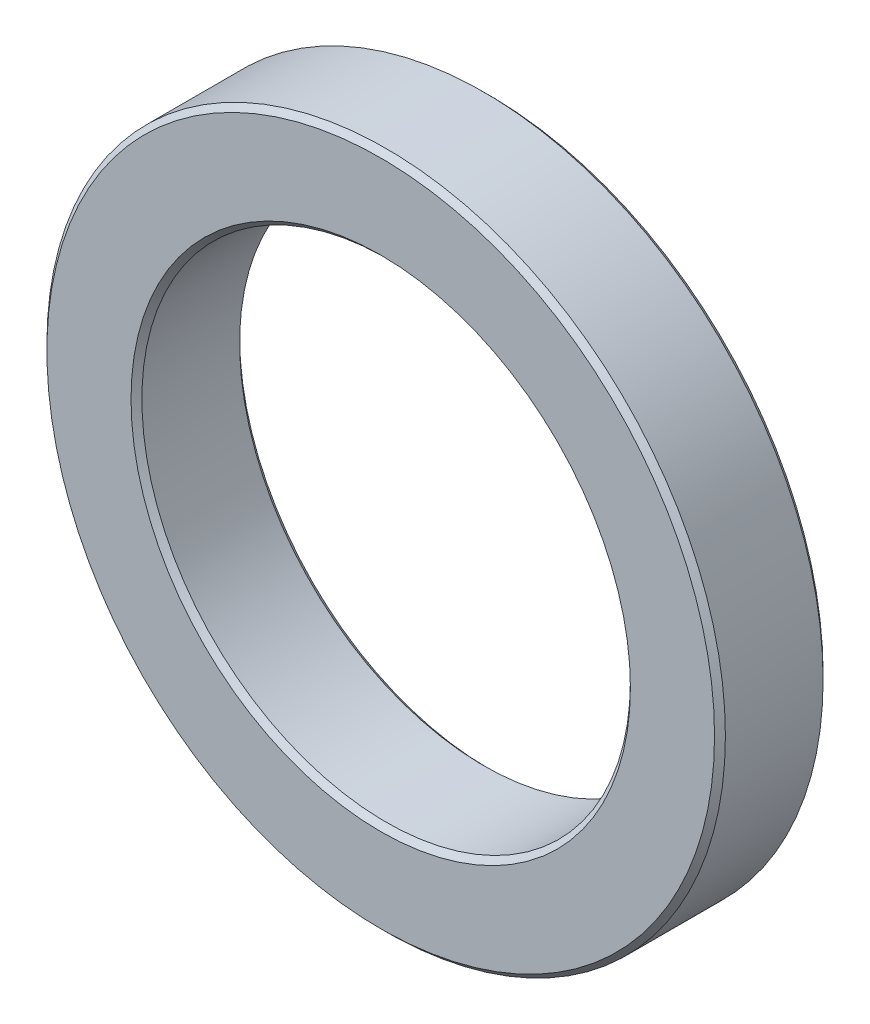
ISO-10303-21;
HEADER;
FILE_DESCRIPTION(('STEP AP214'),'2;1');
FILE_NAME('part.step','',(''),(''),'','','');
FILE_SCHEMA(('AUTOMOTIVE_DESIGN { 1 0 10303 214 1 1 1 1 }'));
ENDSEC;
DATA;
#1=APPLICATION_CONTEXT('core data for automotive mechanical design processes');
#2=APPLICATION_PROTOCOL_DEFINITION('international standard','automotive_design',2000,#1);
#3=PRODUCT_CONTEXT('',#1,'mechanical');
#4=PRODUCT('Part','Part','',(#3));
#5=PRODUCT_RELATED_PRODUCT_CATEGORY('part','',(#4));
#6=PRODUCT_DEFINITION_FORMATION('','',#4);
#7=PRODUCT_DEFINITION_CONTEXT('part definition',#1,'design');
#8=PRODUCT_DEFINITION('design','',#6,#7);
#9=PRODUCT_DEFINITION_SHAPE('','',#8);
#10=(LENGTH_UNIT() NAMED_UNIT(*) SI_UNIT(.MILLI.,.METRE.));
#11=(NAMED_UNIT(*) PLANE_ANGLE_UNIT() SI_UNIT($,.RADIAN.));
#12=(NAMED_UNIT(*) SI_UNIT($,.STERADIAN.) SOLID_ANGLE_UNIT());
#13=UNCERTAINTY_MEASURE_WITH_UNIT(LENGTH_MEASURE(1.E-05),#10,'distance_accuracy_value','');
#14=(GEOMETRIC_REPRESENTATION_CONTEXT(3) GLOBAL_UNCERTAINTY_ASSIGNED_CONTEXT((#13)) GLOBAL_UNIT_ASSIGNED_CONTEXT((#10,
#11,#12)) REPRESENTATION_CONTEXT('',''));
#15=CARTESIAN_POINT('',(0.,0.,0.));
#16=DIRECTION('',(0.,0.,1.));
#17=DIRECTION('',(1.,0.,0.));
#18=AXIS2_PLACEMENT_3D('',#15,#16,#17);
#19=CARTESIAN_POINT('',(0.,0.,10.));
#20=DIRECTION('',(0.,0.,1.));
#21=DIRECTION('',(1.,0.,0.));
#22=AXIS2_PLACEMENT_3D('',#19,#20,#21);
#23=PLANE('',#22);
#24=CARTESIAN_POINT('',(0.,0.,10.));
#25=DIRECTION('',(0.,0.,1.));
#26=DIRECTION('',(1.,0.,0.));
#27=AXIS2_PLACEMENT_3D('',#24,#25,#26);
#28=CIRCLE('',#27,61.5);
#29=CARTESIAN_POINT('',(61.5,0.,10.));
#30=VERTEX_POINT('',#29);
#31=EDGE_CURVE('E56',#30,#30,#28,.T.);
#32=ORIENTED_EDGE('',*,*,#31,.T.);
#33=EDGE_LOOP('',(#32));
#34=FACE_BOUND('',#33,.T.);
#35=CARTESIAN_POINT('',(0.,0.,10.));
#36=DIRECTION('',(0.,0.,1.));
#37=DIRECTION('',(1.,0.,0.));
#38=AXIS2_PLACEMENT_3D('',#35,#36,#37);
#39=CIRCLE('',#38,46.);
#40=CARTESIAN_POINT('',(46.,0.,10.));
#41=VERTEX_POINT('',#40);
#42=EDGE_CURVE('E61',#41,#41,#39,.F.);
#43=ORIENTED_EDGE('',*,*,#42,.T.);
#44=EDGE_LOOP('',(#43));
#45=FACE_BOUND('',#44,.T.);
#46=ADVANCED_FACE('F42',(#34,#45),#23,.T.);
#47=CARTESIAN_POINT('',(0.,0.,-10.));
#48=DIRECTION('',(0.,0.,1.));
#49=DIRECTION('',(1.,0.,0.));
#50=AXIS2_PLACEMENT_3D('',#47,#48,#49);
#51=PLANE('',#50);
#52=CARTESIAN_POINT('',(0.,0.,-10.));
#53=DIRECTION('',(0.,0.,1.));
#54=DIRECTION('',(1.,0.,0.));
#55=AXIS2_PLACEMENT_3D('',#52,#53,#54);
#56=CIRCLE('',#55,61.5);
#57=CARTESIAN_POINT('',(61.5,0.,-10.));
#58=VERTEX_POINT('',#57);
#59=EDGE_CURVE('E67',#58,#58,#56,.F.);
#60=ORIENTED_EDGE('',*,*,#59,.T.);
#61=EDGE_LOOP('',(#60));
#62=FACE_BOUND('',#61,.T.);
#63=CARTESIAN_POINT('',(0.,0.,-10.));
#64=DIRECTION('',(0.,0.,1.));
#65=DIRECTION('',(1.,0.,0.));
#66=AXIS2_PLACEMENT_3D('',#63,#64,#65);
#67=CIRCLE('',#66,46.);
#68=CARTESIAN_POINT('',(46.,0.,-10.));
#69=VERTEX_POINT('',#68);
#70=EDGE_CURVE('E71',#69,#69,#67,.T.);
#71=ORIENTED_EDGE('',*,*,#70,.T.);
#72=EDGE_LOOP('',(#71));
#73=FACE_BOUND('',#72,.T.);
#74=ADVANCED_FACE('F96',(#62,#73),#51,.F.);
#75=CARTESIAN_POINT('',(0.,0.,10.));
#76=DIRECTION('',(0.,0.,-1.));
#77=DIRECTION('',(-1.,0.,0.));
#78=AXIS2_PLACEMENT_3D('',#75,#76,#77);
#79=CYLINDRICAL_SURFACE('',#78,62.5);
#80=CARTESIAN_POINT('',(0.,0.,-8.99999999999998));
#81=DIRECTION('',(0.,0.,1.));
#82=DIRECTION('',(1.,0.,0.));
#83=AXIS2_PLACEMENT_3D('',#80,#81,#82);
#84=CIRCLE('',#83,62.5);
#85=CARTESIAN_POINT('',(62.5,0.,-8.99999999999998));
#86=VERTEX_POINT('',#85);
#87=EDGE_CURVE('E75',#86,#86,#84,.T.);
#88=ORIENTED_EDGE('',*,*,#87,.T.);
#89=EDGE_LOOP('',(#88));
#90=FACE_BOUND('',#89,.T.);
#91=CARTESIAN_POINT('',(0.,0.,8.99999999999999));
#92=DIRECTION('',(0.,0.,1.));
#93=DIRECTION('',(1.,0.,0.));
#94=AXIS2_PLACEMENT_3D('',#91,#92,#93);
#95=CIRCLE('',#94,62.5);
#96=CARTESIAN_POINT('',(62.5,0.,8.99999999999999));
#97=VERTEX_POINT('',#96);
#98=EDGE_CURVE('E79',#97,#97,#95,.F.);
#99=ORIENTED_EDGE('',*,*,#98,.T.);
#100=EDGE_LOOP('',(#99));
#101=FACE_BOUND('',#100,.T.);
#102=ADVANCED_FACE('F84',(#90,#101),#79,.T.);
#103=CARTESIAN_POINT('',(0.,0.,10.));
#104=DIRECTION('',(0.,0.,-1.));
#105=DIRECTION('',(-1.,0.,0.));
#106=AXIS2_PLACEMENT_3D('',#103,#104,#105);
#107=CYLINDRICAL_SURFACE('',#106,45.);
#108=CARTESIAN_POINT('',(0.,0.,-9.00000000000001));
#109=DIRECTION('',(0.,0.,1.));
#110=DIRECTION('',(1.,0.,0.));
#111=AXIS2_PLACEMENT_3D('',#108,#109,#110);
#112=CIRCLE('',#111,45.);
#113=CARTESIAN_POINT('',(45.,0.,-9.00000000000001));
#114=VERTEX_POINT('',#113);
#115=EDGE_CURVE('E10',#114,#114,#112,.F.);
#116=ORIENTED_EDGE('',*,*,#115,.T.);
#117=EDGE_LOOP('',(#116));
#118=FACE_BOUND('',#117,.T.);
#119=CARTESIAN_POINT('',(0.,0.,9.));
#120=DIRECTION('',(0.,0.,1.));
#121=DIRECTION('',(1.,0.,0.));
#122=AXIS2_PLACEMENT_3D('',#119,#120,#121);
#123=CIRCLE('',#122,45.);
#124=CARTESIAN_POINT('',(45.,0.,9.));
#125=VERTEX_POINT('',#124);
#126=EDGE_CURVE('E51',#125,#125,#123,.T.);
#127=ORIENTED_EDGE('',*,*,#126,.T.);
#128=EDGE_LOOP('',(#127));
#129=FACE_BOUND('',#128,.T.);
#130=ADVANCED_FACE('F121',(#118,#129),#107,.F.);
#131=CARTESIAN_POINT('',(0.,0.,-8.99999999999998));
#132=DIRECTION('',(0.,0.,1.));
#133=DIRECTION('',(1.,0.,0.));
#134=AXIS2_PLACEMENT_3D('',#131,#132,#133);
#135=CONICAL_SURFACE('',#134,62.5,0.785398163397445);
#136=ORIENTED_EDGE('',*,*,#59,.F.);
#137=EDGE_LOOP('',(#136));
#138=FACE_BOUND('',#137,.T.);
#139=ORIENTED_EDGE('',*,*,#87,.F.);
#140=EDGE_LOOP('',(#139));
#141=FACE_BOUND('',#140,.T.);
#142=ADVANCED_FACE('F90',(#138,#141),#135,.T.);
#143=CARTESIAN_POINT('',(0.,0.,10.));
#144=DIRECTION('',(0.,0.,-1.));
#145=DIRECTION('',(-1.,0.,0.));
#146=AXIS2_PLACEMENT_3D('',#143,#144,#145);
#147=CONICAL_SURFACE('',#146,61.5,0.785398163397441);
#148=ORIENTED_EDGE('',*,*,#98,.F.);
#149=EDGE_LOOP('',(#148));
#150=FACE_BOUND('',#149,.T.);
#151=ORIENTED_EDGE('',*,*,#31,.F.);
#152=EDGE_LOOP('',(#151));
#153=FACE_BOUND('',#152,.T.);
#154=ADVANCED_FACE('F86',(#150,#153),#147,.T.);
#155=CARTESIAN_POINT('',(0.,0.,-10.));
#156=DIRECTION('',(0.,0.,-1.));
#157=DIRECTION('',(-1.,0.,0.));
#158=AXIS2_PLACEMENT_3D('',#155,#156,#157);
#159=CONICAL_SURFACE('',#158,46.,0.785398163397441);
#160=ORIENTED_EDGE('',*,*,#115,.F.);
#161=EDGE_LOOP('',(#160));
#162=FACE_BOUND('',#161,.T.);
#163=ORIENTED_EDGE('',*,*,#70,.F.);
#164=EDGE_LOOP('',(#163));
#165=FACE_BOUND('',#164,.T.);
#166=ADVANCED_FACE('F89',(#162,#165),#159,.F.);
#167=CARTESIAN_POINT('',(0.,0.,9.));
#168=DIRECTION('',(0.,0.,1.));
#169=DIRECTION('',(1.,0.,0.));
#170=AXIS2_PLACEMENT_3D('',#167,#168,#169);
#171=CONICAL_SURFACE('',#170,45.,0.785398163397448);
#172=ORIENTED_EDGE('',*,*,#42,.F.);
#173=EDGE_LOOP('',(#172));
#174=FACE_BOUND('',#173,.T.);
#175=ORIENTED_EDGE('',*,*,#126,.F.);
#176=EDGE_LOOP('',(#175));
#177=FACE_BOUND('',#176,.T.);
#178=ADVANCED_FACE('F45',(#174,#177),#171,.F.);
#179=CLOSED_SHELL('',(#46,#74,#102,#130,#142,#154,#166,#178));
#180=MANIFOLD_SOLID_BREP('B2',#179);
#181=ADVANCED_BREP_SHAPE_REPRESENTATION('',(#18,#180),#14);
#182=SHAPE_DEFINITION_REPRESENTATION(#9,#181);
ENDSEC;
END-ISO-10303-21;
